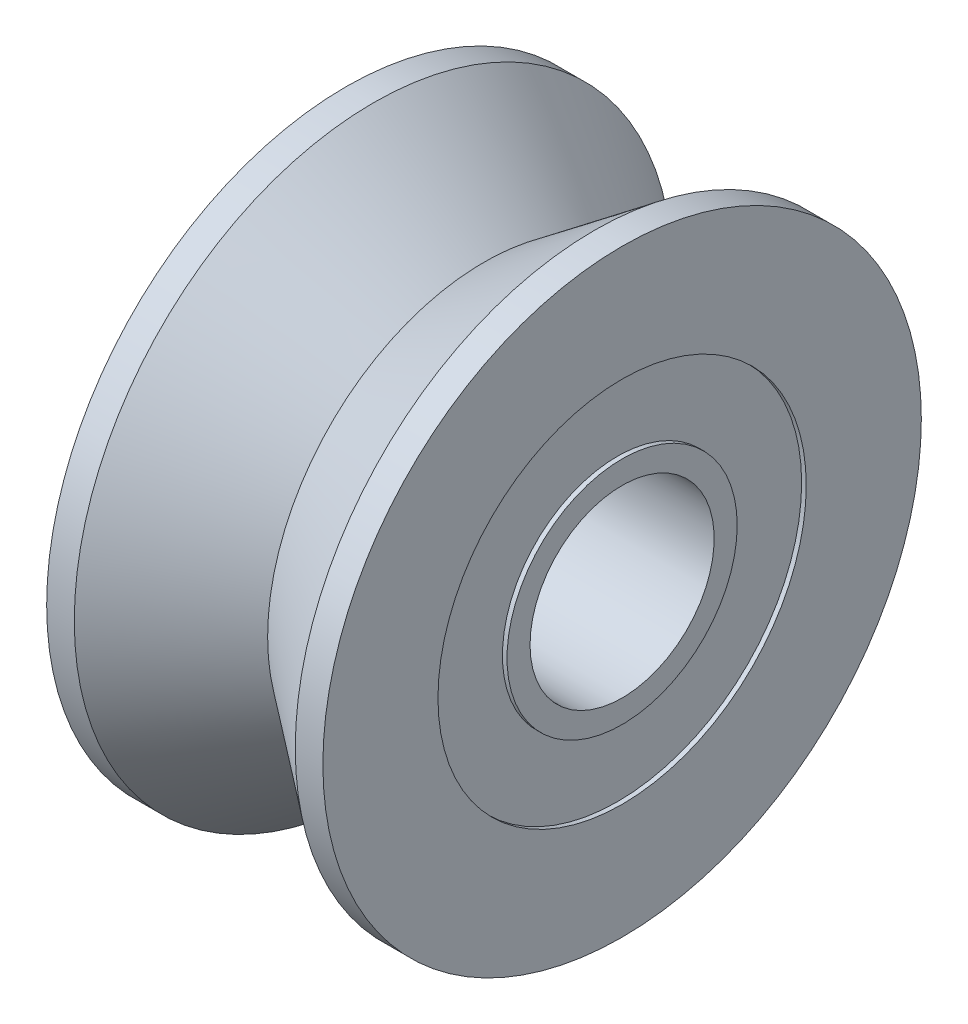
ISO-10303-21;
HEADER;
FILE_DESCRIPTION(('STEP AP214'),'2;1');
FILE_NAME('part.step','',(''),(''),'','','');
FILE_SCHEMA(('AUTOMOTIVE_DESIGN { 1 0 10303 214 1 1 1 1 }'));
ENDSEC;
DATA;
#1=APPLICATION_CONTEXT('core data for automotive mechanical design processes');
#2=APPLICATION_PROTOCOL_DEFINITION('international standard','automotive_design',2000,#1);
#3=PRODUCT_CONTEXT('',#1,'mechanical');
#4=PRODUCT('Part','Part','',(#3));
#5=PRODUCT_RELATED_PRODUCT_CATEGORY('part','',(#4));
#6=PRODUCT_DEFINITION_FORMATION('','',#4);
#7=PRODUCT_DEFINITION_CONTEXT('part definition',#1,'design');
#8=PRODUCT_DEFINITION('design','',#6,#7);
#9=PRODUCT_DEFINITION_SHAPE('','',#8);
#10=(LENGTH_UNIT() NAMED_UNIT(*) SI_UNIT(.MILLI.,.METRE.));
#11=(NAMED_UNIT(*) PLANE_ANGLE_UNIT() SI_UNIT($,.RADIAN.));
#12=(NAMED_UNIT(*) SI_UNIT($,.STERADIAN.) SOLID_ANGLE_UNIT());
#13=UNCERTAINTY_MEASURE_WITH_UNIT(LENGTH_MEASURE(1.E-05),#10,'distance_accuracy_value','');
#14=(GEOMETRIC_REPRESENTATION_CONTEXT(3) GLOBAL_UNCERTAINTY_ASSIGNED_CONTEXT((#13)) GLOBAL_UNIT_ASSIGNED_CONTEXT((#10,
#11,#12)) REPRESENTATION_CONTEXT('',''));
#15=CARTESIAN_POINT('',(0.,0.,0.));
#16=DIRECTION('',(0.,0.,1.));
#17=DIRECTION('',(1.,0.,0.));
#18=AXIS2_PLACEMENT_3D('',#15,#16,#17);
#19=CARTESIAN_POINT('',(-3.,2.,0.));
#20=DIRECTION('',(1.,0.,0.));
#21=DIRECTION('',(0.,0.,-1.));
#22=AXIS2_PLACEMENT_3D('',#19,#20,#21);
#23=PLANE('',#22);
#24=CARTESIAN_POINT('',(-3.,0.,0.));
#25=DIRECTION('',(-1.,0.,0.));
#26=DIRECTION('',(0.,0.,1.));
#27=AXIS2_PLACEMENT_3D('',#24,#25,#26);
#28=CIRCLE('',#27,2.);
#29=CARTESIAN_POINT('',(-3.,0.,2.));
#30=VERTEX_POINT('',#29);
#31=EDGE_CURVE('E52',#30,#30,#28,.T.);
#32=ORIENTED_EDGE('',*,*,#31,.F.);
#33=EDGE_LOOP('',(#32));
#34=FACE_BOUND('',#33,.T.);
#35=CARTESIAN_POINT('',(-3.,0.,0.));
#36=DIRECTION('',(1.,0.,0.));
#37=DIRECTION('',(0.,0.,-1.));
#38=AXIS2_PLACEMENT_3D('',#35,#36,#37);
#39=CIRCLE('',#38,2.5);
#40=CARTESIAN_POINT('',(-3.,0.,-2.5));
#41=VERTEX_POINT('',#40);
#42=EDGE_CURVE('E98',#41,#41,#39,.T.);
#43=ORIENTED_EDGE('',*,*,#42,.F.);
#44=EDGE_LOOP('',(#43));
#45=FACE_BOUND('',#44,.T.);
#46=ADVANCED_FACE('F45',(#34,#45),#23,.F.);
#47=CARTESIAN_POINT('',(3.,2.,0.));
#48=DIRECTION('',(-1.,0.,0.));
#49=DIRECTION('',(0.,0.,1.));
#50=AXIS2_PLACEMENT_3D('',#47,#48,#49);
#51=PLANE('',#50);
#52=CARTESIAN_POINT('',(3.,0.,0.));
#53=DIRECTION('',(-1.,0.,0.));
#54=DIRECTION('',(0.,0.,1.));
#55=AXIS2_PLACEMENT_3D('',#52,#53,#54);
#56=CIRCLE('',#55,2.);
#57=CARTESIAN_POINT('',(3.,0.,2.));
#58=VERTEX_POINT('',#57);
#59=EDGE_CURVE('E56',#58,#58,#56,.T.);
#60=ORIENTED_EDGE('',*,*,#59,.T.);
#61=EDGE_LOOP('',(#60));
#62=FACE_BOUND('',#61,.T.);
#63=CARTESIAN_POINT('',(3.,0.,0.));
#64=DIRECTION('',(1.,0.,0.));
#65=DIRECTION('',(0.,0.,-1.));
#66=AXIS2_PLACEMENT_3D('',#63,#64,#65);
#67=CIRCLE('',#66,2.5);
#68=CARTESIAN_POINT('',(3.,0.,-2.5));
#69=VERTEX_POINT('',#68);
#70=EDGE_CURVE('E84',#69,#69,#67,.T.);
#71=ORIENTED_EDGE('',*,*,#70,.T.);
#72=EDGE_LOOP('',(#71));
#73=FACE_BOUND('',#72,.T.);
#74=ADVANCED_FACE('F114',(#62,#73),#51,.F.);
#75=CARTESIAN_POINT('',(0.,0.,0.));
#76=DIRECTION('',(-1.,0.,0.));
#77=DIRECTION('',(0.,0.,1.));
#78=AXIS2_PLACEMENT_3D('',#75,#76,#77);
#79=CYLINDRICAL_SURFACE('',#78,6.5);
#80=CARTESIAN_POINT('',(-3.,0.,0.));
#81=DIRECTION('',(-1.,0.,0.));
#82=DIRECTION('',(0.,0.,1.));
#83=AXIS2_PLACEMENT_3D('',#80,#81,#82);
#84=CIRCLE('',#83,6.5);
#85=CARTESIAN_POINT('',(-3.,0.,6.5));
#86=VERTEX_POINT('',#85);
#87=EDGE_CURVE('E10',#86,#86,#84,.T.);
#88=ORIENTED_EDGE('',*,*,#87,.F.);
#89=EDGE_LOOP('',(#88));
#90=FACE_BOUND('',#89,.T.);
#91=CARTESIAN_POINT('',(-2.4,0.,0.));
#92=DIRECTION('',(-1.,0.,0.));
#93=DIRECTION('',(0.,0.,1.));
#94=AXIS2_PLACEMENT_3D('',#91,#92,#93);
#95=CIRCLE('',#94,6.5);
#96=CARTESIAN_POINT('',(-2.4,0.,6.5));
#97=VERTEX_POINT('',#96);
#98=EDGE_CURVE('E72',#97,#97,#95,.T.);
#99=ORIENTED_EDGE('',*,*,#98,.T.);
#100=EDGE_LOOP('',(#99));
#101=FACE_BOUND('',#100,.T.);
#102=ADVANCED_FACE('F47',(#90,#101),#79,.T.);
#103=CARTESIAN_POINT('',(-3.,0.,0.));
#104=DIRECTION('',(1.,0.,0.));
#105=DIRECTION('',(0.,0.,-1.));
#106=AXIS2_PLACEMENT_3D('',#103,#104,#105);
#107=CIRCLE('',#106,4.);
#108=CARTESIAN_POINT('',(-3.,0.,-4.));
#109=VERTEX_POINT('',#108);
#110=EDGE_CURVE('E92',#109,#109,#107,.T.);
#111=ORIENTED_EDGE('',*,*,#110,.T.);
#112=EDGE_LOOP('',(#111));
#113=FACE_BOUND('',#112,.T.);
#114=ORIENTED_EDGE('',*,*,#87,.T.);
#115=EDGE_LOOP('',(#114));
#116=FACE_BOUND('',#115,.T.);
#117=ADVANCED_FACE('F116',(#113,#116),#23,.F.);
#118=CARTESIAN_POINT('',(0.,0.,0.));
#119=DIRECTION('',(-1.,0.,0.));
#120=DIRECTION('',(0.,0.,1.));
#121=AXIS2_PLACEMENT_3D('',#118,#119,#120);
#122=CYLINDRICAL_SURFACE('',#121,2.);
#123=ORIENTED_EDGE('',*,*,#59,.F.);
#124=EDGE_LOOP('',(#123));
#125=FACE_BOUND('',#124,.T.);
#126=ORIENTED_EDGE('',*,*,#31,.T.);
#127=EDGE_LOOP('',(#126));
#128=FACE_BOUND('',#127,.T.);
#129=ADVANCED_FACE('F126',(#125,#128),#122,.F.);
#130=CARTESIAN_POINT('',(3.,0.,0.));
#131=DIRECTION('',(1.,0.,0.));
#132=DIRECTION('',(0.,0.,-1.));
#133=AXIS2_PLACEMENT_3D('',#130,#131,#132);
#134=CIRCLE('',#133,4.);
#135=CARTESIAN_POINT('',(3.,0.,-4.));
#136=VERTEX_POINT('',#135);
#137=EDGE_CURVE('E76',#136,#136,#134,.T.);
#138=ORIENTED_EDGE('',*,*,#137,.F.);
#139=EDGE_LOOP('',(#138));
#140=FACE_BOUND('',#139,.T.);
#141=CARTESIAN_POINT('',(3.,0.,0.));
#142=DIRECTION('',(-1.,0.,0.));
#143=DIRECTION('',(0.,0.,1.));
#144=AXIS2_PLACEMENT_3D('',#141,#142,#143);
#145=CIRCLE('',#144,6.5);
#146=CARTESIAN_POINT('',(3.,0.,6.5));
#147=VERTEX_POINT('',#146);
#148=EDGE_CURVE('E61',#147,#147,#145,.T.);
#149=ORIENTED_EDGE('',*,*,#148,.F.);
#150=EDGE_LOOP('',(#149));
#151=FACE_BOUND('',#150,.T.);
#152=ADVANCED_FACE('F124',(#140,#151),#51,.F.);
#153=CARTESIAN_POINT('',(0.,0.,0.));
#154=DIRECTION('',(-1.,0.,0.));
#155=DIRECTION('',(0.,0.,1.));
#156=AXIS2_PLACEMENT_3D('',#153,#154,#155);
#157=CYLINDRICAL_SURFACE('',#156,6.5);
#158=CARTESIAN_POINT('',(2.4,0.,0.));
#159=DIRECTION('',(-1.,0.,0.));
#160=DIRECTION('',(0.,0.,1.));
#161=AXIS2_PLACEMENT_3D('',#158,#159,#160);
#162=CIRCLE('',#161,6.5);
#163=CARTESIAN_POINT('',(2.4,0.,6.5));
#164=VERTEX_POINT('',#163);
#165=EDGE_CURVE('E66',#164,#164,#162,.T.);
#166=ORIENTED_EDGE('',*,*,#165,.F.);
#167=EDGE_LOOP('',(#166));
#168=FACE_BOUND('',#167,.T.);
#169=ORIENTED_EDGE('',*,*,#148,.T.);
#170=EDGE_LOOP('',(#169));
#171=FACE_BOUND('',#170,.T.);
#172=ADVANCED_FACE('F165',(#168,#171),#157,.T.);
#173=CARTESIAN_POINT('',(2.4,0.,0.));
#174=DIRECTION('',(1.,0.,0.));
#175=DIRECTION('',(0.,0.,-1.));
#176=AXIS2_PLACEMENT_3D('',#173,#174,#175);
#177=CONICAL_SURFACE('',#176,6.5,0.643501108793284);
#178=CARTESIAN_POINT('',(0.,0.,0.));
#179=DIRECTION('',(-1.,0.,0.));
#180=DIRECTION('',(0.,0.,1.));
#181=AXIS2_PLACEMENT_3D('',#178,#179,#180);
#182=CIRCLE('',#181,4.7);
#183=CARTESIAN_POINT('',(0.,0.,4.7));
#184=VERTEX_POINT('',#183);
#185=EDGE_CURVE('E69',#184,#184,#182,.T.);
#186=ORIENTED_EDGE('',*,*,#185,.F.);
#187=EDGE_LOOP('',(#186));
#188=FACE_BOUND('',#187,.T.);
#189=ORIENTED_EDGE('',*,*,#165,.T.);
#190=EDGE_LOOP('',(#189));
#191=FACE_BOUND('',#190,.T.);
#192=ADVANCED_FACE('F161',(#188,#191),#177,.T.);
#193=CARTESIAN_POINT('',(0.,0.,0.));
#194=DIRECTION('',(-1.,0.,0.));
#195=DIRECTION('',(0.,0.,1.));
#196=AXIS2_PLACEMENT_3D('',#193,#194,#195);
#197=CONICAL_SURFACE('',#196,4.7,0.643501108793284);
#198=ORIENTED_EDGE('',*,*,#98,.F.);
#199=EDGE_LOOP('',(#198));
#200=FACE_BOUND('',#199,.T.);
#201=ORIENTED_EDGE('',*,*,#185,.T.);
#202=EDGE_LOOP('',(#201));
#203=FACE_BOUND('',#202,.T.);
#204=ADVANCED_FACE('F157',(#200,#203),#197,.T.);
#205=CARTESIAN_POINT('',(2.9,0.,0.));
#206=DIRECTION('',(1.,0.,0.));
#207=DIRECTION('',(0.,0.,-1.));
#208=AXIS2_PLACEMENT_3D('',#205,#206,#207);
#209=CYLINDRICAL_SURFACE('',#208,4.);
#210=CARTESIAN_POINT('',(2.9,0.,0.));
#211=DIRECTION('',(1.,0.,0.));
#212=DIRECTION('',(0.,0.,-1.));
#213=AXIS2_PLACEMENT_3D('',#210,#211,#212);
#214=CIRCLE('',#213,4.);
#215=CARTESIAN_POINT('',(2.9,0.,-4.));
#216=VERTEX_POINT('',#215);
#217=EDGE_CURVE('E75',#216,#216,#214,.T.);
#218=ORIENTED_EDGE('',*,*,#217,.F.);
#219=EDGE_LOOP('',(#218));
#220=FACE_BOUND('',#219,.T.);
#221=ORIENTED_EDGE('',*,*,#137,.T.);
#222=EDGE_LOOP('',(#221));
#223=FACE_BOUND('',#222,.T.);
#224=ADVANCED_FACE('F153',(#220,#223),#209,.F.);
#225=CARTESIAN_POINT('',(2.9,0.,0.));
#226=DIRECTION('',(1.,0.,0.));
#227=DIRECTION('',(0.,0.,-1.));
#228=AXIS2_PLACEMENT_3D('',#225,#226,#227);
#229=PLANE('',#228);
#230=CARTESIAN_POINT('',(2.9,0.,0.));
#231=DIRECTION('',(1.,0.,0.));
#232=DIRECTION('',(0.,0.,-1.));
#233=AXIS2_PLACEMENT_3D('',#230,#231,#232);
#234=CIRCLE('',#233,2.5);
#235=CARTESIAN_POINT('',(2.9,0.,-2.5));
#236=VERTEX_POINT('',#235);
#237=EDGE_CURVE('E80',#236,#236,#234,.T.);
#238=ORIENTED_EDGE('',*,*,#237,.F.);
#239=EDGE_LOOP('',(#238));
#240=FACE_BOUND('',#239,.T.);
#241=ORIENTED_EDGE('',*,*,#217,.T.);
#242=EDGE_LOOP('',(#241));
#243=FACE_BOUND('',#242,.T.);
#244=ADVANCED_FACE('F149',(#240,#243),#229,.T.);
#245=CARTESIAN_POINT('',(2.9,0.,0.));
#246=DIRECTION('',(1.,0.,0.));
#247=DIRECTION('',(0.,0.,-1.));
#248=AXIS2_PLACEMENT_3D('',#245,#246,#247);
#249=CYLINDRICAL_SURFACE('',#248,2.5);
#250=ORIENTED_EDGE('',*,*,#237,.T.);
#251=EDGE_LOOP('',(#250));
#252=FACE_BOUND('',#251,.T.);
#253=ORIENTED_EDGE('',*,*,#70,.F.);
#254=EDGE_LOOP('',(#253));
#255=FACE_BOUND('',#254,.T.);
#256=ADVANCED_FACE('F143',(#252,#255),#249,.T.);
#257=CARTESIAN_POINT('',(-2.9,0.,0.));
#258=DIRECTION('',(-1.,0.,0.));
#259=DIRECTION('',(0.,0.,-1.));
#260=AXIS2_PLACEMENT_3D('',#257,#258,#259);
#261=PLANE('',#260);
#262=CARTESIAN_POINT('',(-2.9,0.,0.));
#263=DIRECTION('',(1.,0.,0.));
#264=DIRECTION('',(0.,0.,-1.));
#265=AXIS2_PLACEMENT_3D('',#262,#263,#264);
#266=CIRCLE('',#265,4.);
#267=CARTESIAN_POINT('',(-2.9,0.,-4.));
#268=VERTEX_POINT('',#267);
#269=EDGE_CURVE('E88',#268,#268,#266,.T.);
#270=ORIENTED_EDGE('',*,*,#269,.F.);
#271=EDGE_LOOP('',(#270));
#272=FACE_BOUND('',#271,.T.);
#273=CARTESIAN_POINT('',(-2.9,0.,0.));
#274=DIRECTION('',(1.,0.,0.));
#275=DIRECTION('',(0.,0.,-1.));
#276=AXIS2_PLACEMENT_3D('',#273,#274,#275);
#277=CIRCLE('',#276,2.5);
#278=CARTESIAN_POINT('',(-2.9,0.,-2.5));
#279=VERTEX_POINT('',#278);
#280=EDGE_CURVE('E95',#279,#279,#277,.T.);
#281=ORIENTED_EDGE('',*,*,#280,.T.);
#282=EDGE_LOOP('',(#281));
#283=FACE_BOUND('',#282,.T.);
#284=ADVANCED_FACE('F104',(#272,#283),#261,.T.);
#285=CARTESIAN_POINT('',(-2.9,0.,0.));
#286=DIRECTION('',(-1.,0.,0.));
#287=DIRECTION('',(0.,0.,1.));
#288=AXIS2_PLACEMENT_3D('',#285,#286,#287);
#289=CYLINDRICAL_SURFACE('',#288,4.);
#290=ORIENTED_EDGE('',*,*,#269,.T.);
#291=EDGE_LOOP('',(#290));
#292=FACE_BOUND('',#291,.T.);
#293=ORIENTED_EDGE('',*,*,#110,.F.);
#294=EDGE_LOOP('',(#293));
#295=FACE_BOUND('',#294,.T.);
#296=ADVANCED_FACE('F109',(#292,#295),#289,.F.);
#297=CARTESIAN_POINT('',(-2.9,0.,0.));
#298=DIRECTION('',(-1.,0.,0.));
#299=DIRECTION('',(0.,0.,1.));
#300=AXIS2_PLACEMENT_3D('',#297,#298,#299);
#301=CYLINDRICAL_SURFACE('',#300,2.5);
#302=ORIENTED_EDGE('',*,*,#280,.F.);
#303=EDGE_LOOP('',(#302));
#304=FACE_BOUND('',#303,.T.);
#305=ORIENTED_EDGE('',*,*,#42,.T.);
#306=EDGE_LOOP('',(#305));
#307=FACE_BOUND('',#306,.T.);
#308=ADVANCED_FACE('F106',(#304,#307),#301,.T.);
#309=CLOSED_SHELL('',(#46,#74,#102,#117,#129,#152,#172,#192,#204,#224,#244,#256,#284,#296,#308));
#310=MANIFOLD_SOLID_BREP('B2',#309);
#311=ADVANCED_BREP_SHAPE_REPRESENTATION('',(#18,#310),#14);
#312=SHAPE_DEFINITION_REPRESENTATION(#9,#311);
ENDSEC;
END-ISO-10303-21;
